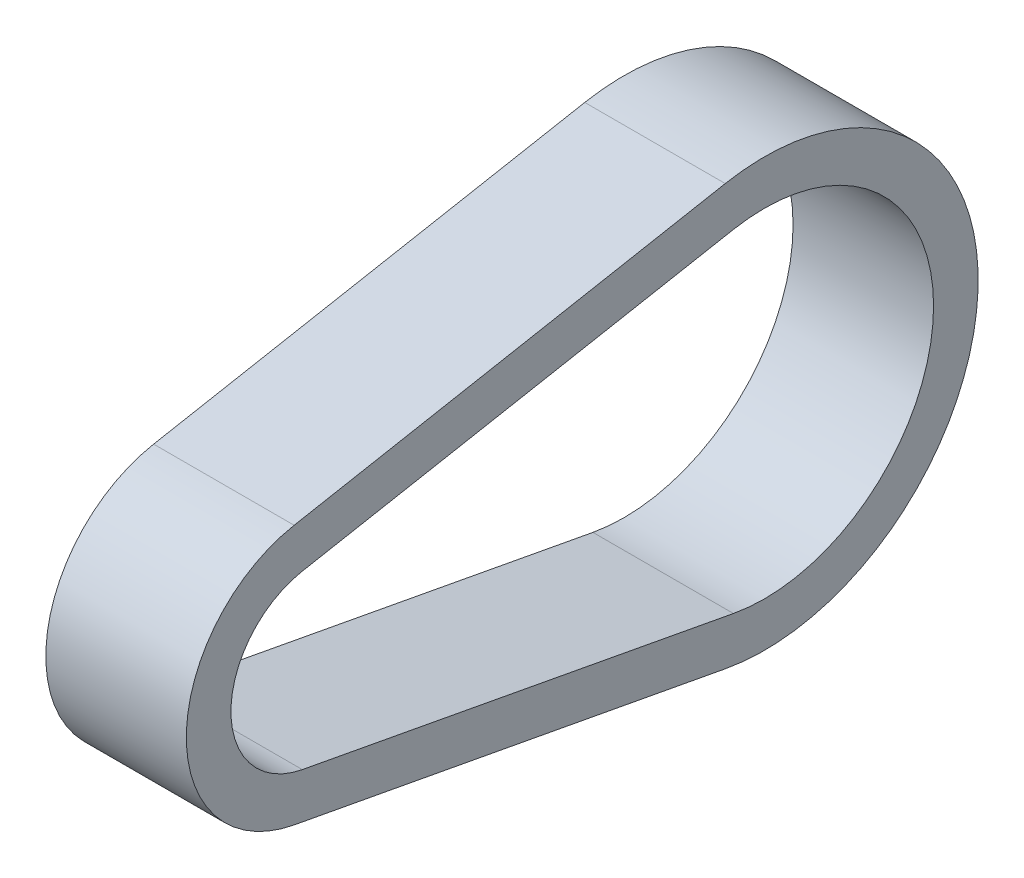
ISO-10303-21;
HEADER;
FILE_DESCRIPTION(('STEP AP214'),'2;1');
FILE_NAME('part.step','',(''),(''),'','','');
FILE_SCHEMA(('AUTOMOTIVE_DESIGN { 1 0 10303 214 1 1 1 1 }'));
ENDSEC;
DATA;
#1=APPLICATION_CONTEXT('core data for automotive mechanical design processes');
#2=APPLICATION_PROTOCOL_DEFINITION('international standard','automotive_design',2000,#1);
#3=PRODUCT_CONTEXT('',#1,'mechanical');
#4=PRODUCT('Part','Part','',(#3));
#5=PRODUCT_RELATED_PRODUCT_CATEGORY('part','',(#4));
#6=PRODUCT_DEFINITION_FORMATION('','',#4);
#7=PRODUCT_DEFINITION_CONTEXT('part definition',#1,'design');
#8=PRODUCT_DEFINITION('design','',#6,#7);
#9=PRODUCT_DEFINITION_SHAPE('','',#8);
#10=(LENGTH_UNIT() NAMED_UNIT(*) SI_UNIT(.MILLI.,.METRE.));
#11=(NAMED_UNIT(*) PLANE_ANGLE_UNIT() SI_UNIT($,.RADIAN.));
#12=(NAMED_UNIT(*) SI_UNIT($,.STERADIAN.) SOLID_ANGLE_UNIT());
#13=UNCERTAINTY_MEASURE_WITH_UNIT(LENGTH_MEASURE(1.E-05),#10,'distance_accuracy_value','');
#14=(GEOMETRIC_REPRESENTATION_CONTEXT(3) GLOBAL_UNCERTAINTY_ASSIGNED_CONTEXT((#13)) GLOBAL_UNIT_ASSIGNED_CONTEXT((#10,
#11,#12)) REPRESENTATION_CONTEXT('',''));
#15=CARTESIAN_POINT('',(0.,0.,0.));
#16=DIRECTION('',(0.,0.,1.));
#17=DIRECTION('',(1.,0.,0.));
#18=AXIS2_PLACEMENT_3D('',#15,#16,#17);
#19=CARTESIAN_POINT('',(7.5,0.,0.));
#20=DIRECTION('',(1.,0.,0.));
#21=DIRECTION('',(0.,0.,-1.));
#22=AXIS2_PLACEMENT_3D('',#19,#20,#21);
#23=PLANE('',#22);
#24=CARTESIAN_POINT('',(7.5,0.,0.));
#25=DIRECTION('',(1.,0.,0.));
#26=DIRECTION('',(0.,0.,-1.));
#27=AXIS2_PLACEMENT_3D('',#24,#25,#26);
#28=CIRCLE('',#27,14.09446);
#29=CARTESIAN_POINT('',(7.5,13.8557805108018,2.58285677653333));
#30=VERTEX_POINT('',#29);
#31=CARTESIAN_POINT('',(7.5,-13.8557805108018,2.58285677653333));
#32=VERTEX_POINT('',#31);
#33=EDGE_CURVE('E136',#30,#32,#28,.T.);
#34=ORIENTED_EDGE('',*,*,#33,.T.);
#35=DIRECTION('',(0.,-0.183253333333333,-0.983065723043084));
#36=VECTOR('',#35,1.);
#37=CARTESIAN_POINT('',(7.5,-13.8557805108018,2.58285677653333));
#38=LINE('',#37,#36);
#39=CARTESIAN_POINT('',(7.5,-22.435427624717,-43.442810752));
#40=VERTEX_POINT('',#39);
#41=EDGE_CURVE('E139',#32,#40,#38,.T.);
#42=ORIENTED_EDGE('',*,*,#41,.T.);
#43=CARTESIAN_POINT('',(7.5,0.,-47.625));
#44=DIRECTION('',(1.,0.,0.));
#45=DIRECTION('',(0.,0.,-1.));
#46=AXIS2_PLACEMENT_3D('',#43,#44,#45);
#47=CIRCLE('',#46,22.8219);
#48=CARTESIAN_POINT('',(7.5,22.435427624717,-43.442810752));
#49=VERTEX_POINT('',#48);
#50=EDGE_CURVE('E142',#40,#49,#47,.T.);
#51=ORIENTED_EDGE('',*,*,#50,.T.);
#52=DIRECTION('',(0.,-0.183253333333333,0.983065723043084));
#53=VECTOR('',#52,1.);
#54=CARTESIAN_POINT('',(7.5,13.8557805108018,2.58285677653333));
#55=LINE('',#54,#53);
#56=EDGE_CURVE('E144',#49,#30,#55,.T.);
#57=ORIENTED_EDGE('',*,*,#56,.T.);
#58=EDGE_LOOP('',(#34,#42,#51,#57));
#59=FACE_BOUND('',#58,.T.);
#60=DIRECTION('',(0.,-0.183253333333333,-0.983065723043084));
#61=VECTOR('',#60,1.);
#62=CARTESIAN_POINT('',(7.5,-9.17393000480914,1.71011277653333));
#63=LINE('',#62,#61);
#64=CARTESIAN_POINT('',(7.5,-9.17393000480914,1.71011277653333));
#65=VERTEX_POINT('',#64);
#66=CARTESIAN_POINT('',(7.5,-17.7535771187243,-44.315554752));
#67=VERTEX_POINT('',#66);
#68=EDGE_CURVE('E108',#65,#67,#63,.T.);
#69=ORIENTED_EDGE('',*,*,#68,.F.);
#70=CARTESIAN_POINT('',(7.5,0.,0.));
#71=DIRECTION('',(1.,0.,0.));
#72=DIRECTION('',(0.,0.,-1.));
#73=AXIS2_PLACEMENT_3D('',#70,#71,#72);
#74=CIRCLE('',#73,9.33196);
#75=CARTESIAN_POINT('',(7.5,9.17393000480914,1.71011277653333));
#76=VERTEX_POINT('',#75);
#77=EDGE_CURVE('E100',#76,#65,#74,.T.);
#78=ORIENTED_EDGE('',*,*,#77,.F.);
#79=DIRECTION('',(0.,-0.183253333333333,0.983065723043084));
#80=VECTOR('',#79,1.);
#81=CARTESIAN_POINT('',(7.5,9.17393000480914,1.71011277653333));
#82=LINE('',#81,#80);
#83=CARTESIAN_POINT('',(7.5,17.7535771187243,-44.315554752));
#84=VERTEX_POINT('',#83);
#85=EDGE_CURVE('E122',#84,#76,#82,.T.);
#86=ORIENTED_EDGE('',*,*,#85,.F.);
#87=CARTESIAN_POINT('',(7.5,0.,-47.625));
#88=DIRECTION('',(1.,0.,0.));
#89=DIRECTION('',(0.,0.,-1.));
#90=AXIS2_PLACEMENT_3D('',#87,#88,#89);
#91=CIRCLE('',#90,18.0594);
#92=EDGE_CURVE('E120',#67,#84,#91,.T.);
#93=ORIENTED_EDGE('',*,*,#92,.F.);
#94=EDGE_LOOP('',(#69,#78,#86,#93));
#95=FACE_BOUND('',#94,.T.);
#96=ADVANCED_FACE('F35',(#59,#95),#23,.T.);
#97=CARTESIAN_POINT('',(-7.5,0.,0.));
#98=DIRECTION('',(1.,0.,0.));
#99=DIRECTION('',(0.,0.,-1.));
#100=AXIS2_PLACEMENT_3D('',#97,#98,#99);
#101=PLANE('',#100);
#102=CARTESIAN_POINT('',(-7.5,0.,0.));
#103=DIRECTION('',(1.,0.,0.));
#104=DIRECTION('',(0.,0.,-1.));
#105=AXIS2_PLACEMENT_3D('',#102,#103,#104);
#106=CIRCLE('',#105,14.09446);
#107=CARTESIAN_POINT('',(-7.5,13.8557805108018,2.58285677653333));
#108=VERTEX_POINT('',#107);
#109=CARTESIAN_POINT('',(-7.5,-13.8557805108018,2.58285677653333));
#110=VERTEX_POINT('',#109);
#111=EDGE_CURVE('E116',#108,#110,#106,.T.);
#112=ORIENTED_EDGE('',*,*,#111,.F.);
#113=DIRECTION('',(0.,-0.183253333333333,0.983065723043084));
#114=VECTOR('',#113,1.);
#115=CARTESIAN_POINT('',(-7.5,13.8557805108018,2.58285677653333));
#116=LINE('',#115,#114);
#117=CARTESIAN_POINT('',(-7.5,22.435427624717,-43.442810752));
#118=VERTEX_POINT('',#117);
#119=EDGE_CURVE('E140',#118,#108,#116,.T.);
#120=ORIENTED_EDGE('',*,*,#119,.F.);
#121=CARTESIAN_POINT('',(-7.5,0.,-47.625));
#122=DIRECTION('',(1.,0.,0.));
#123=DIRECTION('',(0.,0.,-1.));
#124=AXIS2_PLACEMENT_3D('',#121,#122,#123);
#125=CIRCLE('',#124,22.8219);
#126=CARTESIAN_POINT('',(-7.5,-22.435427624717,-43.442810752));
#127=VERTEX_POINT('',#126);
#128=EDGE_CURVE('E151',#127,#118,#125,.T.);
#129=ORIENTED_EDGE('',*,*,#128,.F.);
#130=DIRECTION('',(0.,-0.183253333333333,-0.983065723043084));
#131=VECTOR('',#130,1.);
#132=CARTESIAN_POINT('',(-7.5,-13.8557805108018,2.58285677653333));
#133=LINE('',#132,#131);
#134=EDGE_CURVE('E149',#110,#127,#133,.T.);
#135=ORIENTED_EDGE('',*,*,#134,.F.);
#136=EDGE_LOOP('',(#112,#120,#129,#135));
#137=FACE_BOUND('',#136,.T.);
#138=CARTESIAN_POINT('',(-7.5,0.,0.));
#139=DIRECTION('',(1.,0.,0.));
#140=DIRECTION('',(0.,0.,-1.));
#141=AXIS2_PLACEMENT_3D('',#138,#139,#140);
#142=CIRCLE('',#141,9.33196);
#143=CARTESIAN_POINT('',(-7.5,9.17393000480914,1.71011277653333));
#144=VERTEX_POINT('',#143);
#145=CARTESIAN_POINT('',(-7.5,-9.17393000480914,1.71011277653333));
#146=VERTEX_POINT('',#145);
#147=EDGE_CURVE('E58',#144,#146,#142,.T.);
#148=ORIENTED_EDGE('',*,*,#147,.T.);
#149=DIRECTION('',(0.,-0.183253333333333,-0.983065723043084));
#150=VECTOR('',#149,1.);
#151=CARTESIAN_POINT('',(-7.5,-9.17393000480914,1.71011277653333));
#152=LINE('',#151,#150);
#153=CARTESIAN_POINT('',(-7.5,-17.7535771187243,-44.315554752));
#154=VERTEX_POINT('',#153);
#155=EDGE_CURVE('E115',#146,#154,#152,.T.);
#156=ORIENTED_EDGE('',*,*,#155,.T.);
#157=CARTESIAN_POINT('',(-7.5,0.,-47.625));
#158=DIRECTION('',(1.,0.,0.));
#159=DIRECTION('',(0.,0.,-1.));
#160=AXIS2_PLACEMENT_3D('',#157,#158,#159);
#161=CIRCLE('',#160,18.0594);
#162=CARTESIAN_POINT('',(-7.5,17.7535771187243,-44.315554752));
#163=VERTEX_POINT('',#162);
#164=EDGE_CURVE('E128',#154,#163,#161,.T.);
#165=ORIENTED_EDGE('',*,*,#164,.T.);
#166=DIRECTION('',(0.,-0.183253333333333,0.983065723043084));
#167=VECTOR('',#166,1.);
#168=CARTESIAN_POINT('',(-7.5,9.17393000480914,1.71011277653333));
#169=LINE('',#168,#167);
#170=EDGE_CURVE('E109',#163,#144,#169,.T.);
#171=ORIENTED_EDGE('',*,*,#170,.T.);
#172=EDGE_LOOP('',(#148,#156,#165,#171));
#173=FACE_BOUND('',#172,.T.);
#174=ADVANCED_FACE('F169',(#137,#173),#101,.F.);
#175=CARTESIAN_POINT('',(7.5,0.,0.));
#176=DIRECTION('',(-1.,0.,0.));
#177=DIRECTION('',(0.,0.,1.));
#178=AXIS2_PLACEMENT_3D('',#175,#176,#177);
#179=CYLINDRICAL_SURFACE('',#178,14.09446);
#180=ORIENTED_EDGE('',*,*,#111,.T.);
#181=DIRECTION('',(-1.,0.,0.));
#182=VECTOR('',#181,1.);
#183=CARTESIAN_POINT('',(7.5,-13.8557805108018,2.58285677653333));
#184=LINE('',#183,#182);
#185=EDGE_CURVE('E11',#32,#110,#184,.T.);
#186=ORIENTED_EDGE('',*,*,#185,.F.);
#187=ORIENTED_EDGE('',*,*,#33,.F.);
#188=DIRECTION('',(-1.,0.,0.));
#189=VECTOR('',#188,1.);
#190=CARTESIAN_POINT('',(7.5,13.8557805108018,2.58285677653333));
#191=LINE('',#190,#189);
#192=EDGE_CURVE('E146',#30,#108,#191,.T.);
#193=ORIENTED_EDGE('',*,*,#192,.T.);
#194=EDGE_LOOP('',(#180,#186,#187,#193));
#195=FACE_BOUND('',#194,.T.);
#196=ADVANCED_FACE('F37',(#195),#179,.T.);
#197=CARTESIAN_POINT('',(7.5,-13.8557805108018,2.58285677653333));
#198=DIRECTION('',(0.,0.983065723043084,-0.183253333333333));
#199=DIRECTION('',(0.,0.183253333333333,0.983065723043084));
#200=AXIS2_PLACEMENT_3D('',#197,#198,#199);
#201=PLANE('',#200);
#202=ORIENTED_EDGE('',*,*,#134,.T.);
#203=DIRECTION('',(-1.,0.,0.));
#204=VECTOR('',#203,1.);
#205=CARTESIAN_POINT('',(7.5,-22.435427624717,-43.442810752));
#206=LINE('',#205,#204);
#207=EDGE_CURVE('E43',#40,#127,#206,.T.);
#208=ORIENTED_EDGE('',*,*,#207,.F.);
#209=ORIENTED_EDGE('',*,*,#41,.F.);
#210=ORIENTED_EDGE('',*,*,#185,.T.);
#211=EDGE_LOOP('',(#202,#208,#209,#210));
#212=FACE_BOUND('',#211,.T.);
#213=ADVANCED_FACE('F179',(#212),#201,.F.);
#214=CARTESIAN_POINT('',(7.5,0.,-47.625));
#215=DIRECTION('',(-1.,0.,0.));
#216=DIRECTION('',(0.,0.,1.));
#217=AXIS2_PLACEMENT_3D('',#214,#215,#216);
#218=CYLINDRICAL_SURFACE('',#217,22.8219);
#219=ORIENTED_EDGE('',*,*,#128,.T.);
#220=DIRECTION('',(-1.,0.,0.));
#221=VECTOR('',#220,1.);
#222=CARTESIAN_POINT('',(7.5,22.435427624717,-43.442810752));
#223=LINE('',#222,#221);
#224=EDGE_CURVE('E156',#49,#118,#223,.T.);
#225=ORIENTED_EDGE('',*,*,#224,.F.);
#226=ORIENTED_EDGE('',*,*,#50,.F.);
#227=ORIENTED_EDGE('',*,*,#207,.T.);
#228=EDGE_LOOP('',(#219,#225,#226,#227));
#229=FACE_BOUND('',#228,.T.);
#230=ADVANCED_FACE('F163',(#229),#218,.T.);
#231=CARTESIAN_POINT('',(7.5,13.8557805108018,2.58285677653333));
#232=DIRECTION('',(0.,-0.983065723043084,-0.183253333333333));
#233=DIRECTION('',(0.,0.183253333333333,-0.983065723043084));
#234=AXIS2_PLACEMENT_3D('',#231,#232,#233);
#235=PLANE('',#234);
#236=ORIENTED_EDGE('',*,*,#119,.T.);
#237=ORIENTED_EDGE('',*,*,#192,.F.);
#238=ORIENTED_EDGE('',*,*,#56,.F.);
#239=ORIENTED_EDGE('',*,*,#224,.T.);
#240=EDGE_LOOP('',(#236,#237,#238,#239));
#241=FACE_BOUND('',#240,.T.);
#242=ADVANCED_FACE('F173',(#241),#235,.F.);
#243=CARTESIAN_POINT('',(7.5,0.,0.));
#244=DIRECTION('',(-1.,0.,0.));
#245=DIRECTION('',(0.,0.,1.));
#246=AXIS2_PLACEMENT_3D('',#243,#244,#245);
#247=CYLINDRICAL_SURFACE('',#246,9.33196);
#248=ORIENTED_EDGE('',*,*,#147,.F.);
#249=DIRECTION('',(-1.,0.,0.));
#250=VECTOR('',#249,1.);
#251=CARTESIAN_POINT('',(7.5,9.17393000480914,1.71011277653333));
#252=LINE('',#251,#250);
#253=EDGE_CURVE('E104',#76,#144,#252,.T.);
#254=ORIENTED_EDGE('',*,*,#253,.F.);
#255=ORIENTED_EDGE('',*,*,#77,.T.);
#256=DIRECTION('',(-1.,0.,0.));
#257=VECTOR('',#256,1.);
#258=CARTESIAN_POINT('',(7.5,-9.17393000480914,1.71011277653333));
#259=LINE('',#258,#257);
#260=EDGE_CURVE('E103',#65,#146,#259,.T.);
#261=ORIENTED_EDGE('',*,*,#260,.T.);
#262=EDGE_LOOP('',(#248,#254,#255,#261));
#263=FACE_BOUND('',#262,.T.);
#264=ADVANCED_FACE('F102',(#263),#247,.F.);
#265=CARTESIAN_POINT('',(7.5,-9.17393000480914,1.71011277653333));
#266=DIRECTION('',(0.,0.983065723043084,-0.183253333333333));
#267=DIRECTION('',(0.,0.183253333333333,0.983065723043084));
#268=AXIS2_PLACEMENT_3D('',#265,#266,#267);
#269=PLANE('',#268);
#270=ORIENTED_EDGE('',*,*,#155,.F.);
#271=ORIENTED_EDGE('',*,*,#260,.F.);
#272=ORIENTED_EDGE('',*,*,#68,.T.);
#273=DIRECTION('',(-1.,0.,0.));
#274=VECTOR('',#273,1.);
#275=CARTESIAN_POINT('',(7.5,-17.7535771187243,-44.315554752));
#276=LINE('',#275,#274);
#277=EDGE_CURVE('E117',#67,#154,#276,.T.);
#278=ORIENTED_EDGE('',*,*,#277,.T.);
#279=EDGE_LOOP('',(#270,#271,#272,#278));
#280=FACE_BOUND('',#279,.T.);
#281=ADVANCED_FACE('F112',(#280),#269,.T.);
#282=CARTESIAN_POINT('',(7.5,0.,-47.625));
#283=DIRECTION('',(-1.,0.,0.));
#284=DIRECTION('',(0.,0.,1.));
#285=AXIS2_PLACEMENT_3D('',#282,#283,#284);
#286=CYLINDRICAL_SURFACE('',#285,18.0594);
#287=ORIENTED_EDGE('',*,*,#164,.F.);
#288=ORIENTED_EDGE('',*,*,#277,.F.);
#289=ORIENTED_EDGE('',*,*,#92,.T.);
#290=DIRECTION('',(-1.,0.,0.));
#291=VECTOR('',#290,1.);
#292=CARTESIAN_POINT('',(7.5,17.7535771187243,-44.315554752));
#293=LINE('',#292,#291);
#294=EDGE_CURVE('E50',#84,#163,#293,.T.);
#295=ORIENTED_EDGE('',*,*,#294,.T.);
#296=EDGE_LOOP('',(#287,#288,#289,#295));
#297=FACE_BOUND('',#296,.T.);
#298=ADVANCED_FACE('F202',(#297),#286,.F.);
#299=CARTESIAN_POINT('',(7.5,9.17393000480914,1.71011277653333));
#300=DIRECTION('',(0.,-0.983065723043084,-0.183253333333333));
#301=DIRECTION('',(0.,0.183253333333333,-0.983065723043084));
#302=AXIS2_PLACEMENT_3D('',#299,#300,#301);
#303=PLANE('',#302);
#304=ORIENTED_EDGE('',*,*,#170,.F.);
#305=ORIENTED_EDGE('',*,*,#294,.F.);
#306=ORIENTED_EDGE('',*,*,#85,.T.);
#307=ORIENTED_EDGE('',*,*,#253,.T.);
#308=EDGE_LOOP('',(#304,#305,#306,#307));
#309=FACE_BOUND('',#308,.T.);
#310=ADVANCED_FACE('F206',(#309),#303,.T.);
#311=CLOSED_SHELL('',(#96,#174,#196,#213,#230,#242,#264,#281,#298,#310));
#312=MANIFOLD_SOLID_BREP('B2',#311);
#313=ADVANCED_BREP_SHAPE_REPRESENTATION('',(#18,#312),#14);
#314=SHAPE_DEFINITION_REPRESENTATION(#9,#313);
ENDSEC;
END-ISO-10303-21;
